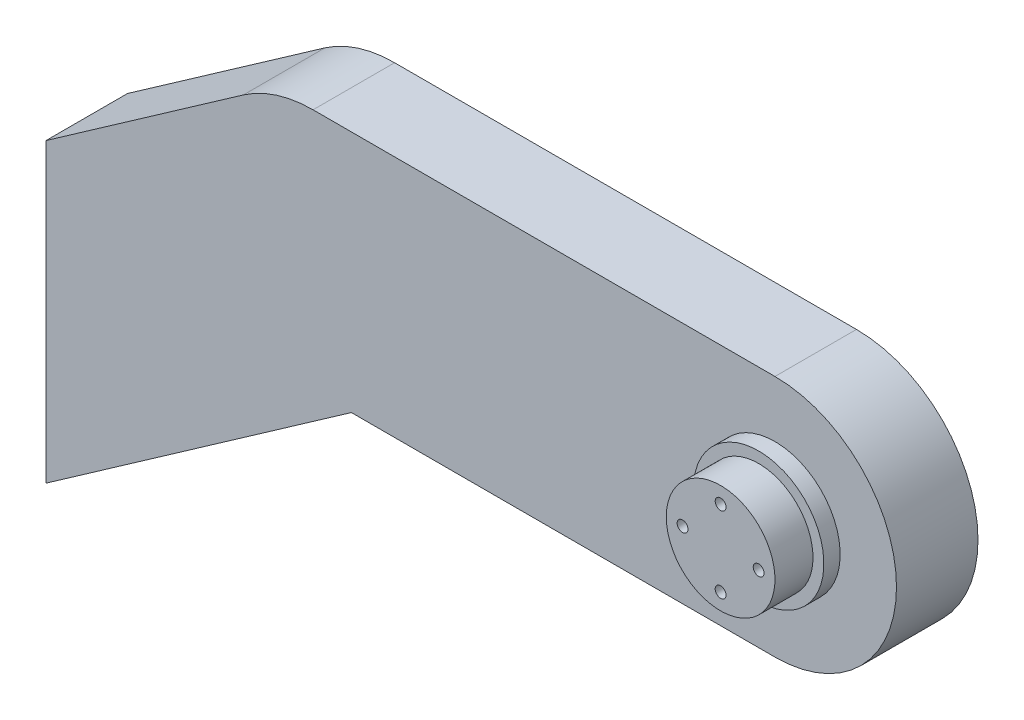
ISO-10303-21;
HEADER;
FILE_DESCRIPTION(('STEP AP214'),'2;1');
FILE_NAME('part.step','',(''),(''),'','','');
FILE_SCHEMA(('AUTOMOTIVE_DESIGN { 1 0 10303 214 1 1 1 1 }'));
ENDSEC;
DATA;
#1=APPLICATION_CONTEXT('core data for automotive mechanical design processes');
#2=APPLICATION_PROTOCOL_DEFINITION('international standard','automotive_design',2000,#1);
#3=PRODUCT_CONTEXT('',#1,'mechanical');
#4=PRODUCT('Part','Part','',(#3));
#5=PRODUCT_RELATED_PRODUCT_CATEGORY('part','',(#4));
#6=PRODUCT_DEFINITION_FORMATION('','',#4);
#7=PRODUCT_DEFINITION_CONTEXT('part definition',#1,'design');
#8=PRODUCT_DEFINITION('design','',#6,#7);
#9=PRODUCT_DEFINITION_SHAPE('','',#8);
#10=(LENGTH_UNIT() NAMED_UNIT(*) SI_UNIT(.MILLI.,.METRE.));
#11=(NAMED_UNIT(*) PLANE_ANGLE_UNIT() SI_UNIT($,.RADIAN.));
#12=(NAMED_UNIT(*) SI_UNIT($,.STERADIAN.) SOLID_ANGLE_UNIT());
#13=UNCERTAINTY_MEASURE_WITH_UNIT(LENGTH_MEASURE(1.E-05),#10,'distance_accuracy_value','');
#14=(GEOMETRIC_REPRESENTATION_CONTEXT(3) GLOBAL_UNCERTAINTY_ASSIGNED_CONTEXT((#13)) GLOBAL_UNIT_ASSIGNED_CONTEXT((#10,
#11,#12)) REPRESENTATION_CONTEXT('',''));
#15=CARTESIAN_POINT('',(0.,0.,0.));
#16=DIRECTION('',(0.,0.,1.));
#17=DIRECTION('',(1.,0.,0.));
#18=AXIS2_PLACEMENT_3D('',#15,#16,#17);
#19=CARTESIAN_POINT('',(153.21162338788,22.365,25.));
#20=DIRECTION('',(0.,0.,-1.));
#21=DIRECTION('',(-1.,0.,0.));
#22=AXIS2_PLACEMENT_3D('',#19,#20,#21);
#23=CYLINDRICAL_SURFACE('',#22,10.);
#24=CARTESIAN_POINT('',(153.21162338788,22.365,25.));
#25=DIRECTION('',(0.,0.,-1.));
#26=DIRECTION('',(-1.,0.,0.));
#27=AXIS2_PLACEMENT_3D('',#24,#25,#26);
#28=CIRCLE('',#27,10.);
#29=CARTESIAN_POINT('',(143.21162338788,22.365,25.));
#30=VERTEX_POINT('',#29);
#31=EDGE_CURVE('E144',#30,#30,#28,.T.);
#32=ORIENTED_EDGE('',*,*,#31,.T.);
#33=EDGE_LOOP('',(#32));
#34=FACE_BOUND('',#33,.T.);
#35=CARTESIAN_POINT('',(153.21162338788,22.365,18.));
#36=DIRECTION('',(0.,0.,-1.));
#37=DIRECTION('',(-1.,0.,0.));
#38=AXIS2_PLACEMENT_3D('',#35,#36,#37);
#39=CIRCLE('',#38,10.);
#40=CARTESIAN_POINT('',(143.21162338788,22.365,18.));
#41=VERTEX_POINT('',#40);
#42=EDGE_CURVE('E195',#41,#41,#39,.T.);
#43=ORIENTED_EDGE('',*,*,#42,.F.);
#44=EDGE_LOOP('',(#43));
#45=FACE_BOUND('',#44,.T.);
#46=ADVANCED_FACE('F50',(#34,#45),#23,.T.);
#47=CARTESIAN_POINT('',(153.21162338788,22.365,25.));
#48=DIRECTION('',(0.,0.,-1.));
#49=DIRECTION('',(-1.,0.,0.));
#50=AXIS2_PLACEMENT_3D('',#47,#48,#49);
#51=PLANE('',#50);
#52=CARTESIAN_POINT('',(153.21162338788,29.365,25.));
#53=DIRECTION('',(0.,0.,1.));
#54=DIRECTION('',(1.,0.,0.));
#55=AXIS2_PLACEMENT_3D('',#52,#53,#54);
#56=CIRCLE('',#55,0.999999999999998);
#57=CARTESIAN_POINT('',(154.21162338788,29.365,25.));
#58=VERTEX_POINT('',#57);
#59=EDGE_CURVE('E151',#58,#58,#56,.T.);
#60=ORIENTED_EDGE('',*,*,#59,.F.);
#61=EDGE_LOOP('',(#60));
#62=FACE_BOUND('',#61,.T.);
#63=CARTESIAN_POINT('',(146.21162338788,22.3649999999999,25.));
#64=DIRECTION('',(0.,0.,1.));
#65=DIRECTION('',(1.,0.,0.));
#66=AXIS2_PLACEMENT_3D('',#63,#64,#65);
#67=CIRCLE('',#66,0.99999999999999);
#68=CARTESIAN_POINT('',(147.21162338788,22.3649999999999,25.));
#69=VERTEX_POINT('',#68);
#70=EDGE_CURVE('E158',#69,#69,#67,.T.);
#71=ORIENTED_EDGE('',*,*,#70,.F.);
#72=EDGE_LOOP('',(#71));
#73=FACE_BOUND('',#72,.T.);
#74=CARTESIAN_POINT('',(153.21162338788,15.365,25.));
#75=DIRECTION('',(0.,0.,1.));
#76=DIRECTION('',(1.,0.,0.));
#77=AXIS2_PLACEMENT_3D('',#74,#75,#76);
#78=CIRCLE('',#77,0.999999999999996);
#79=CARTESIAN_POINT('',(154.21162338788,15.365,25.));
#80=VERTEX_POINT('',#79);
#81=EDGE_CURVE('E154',#80,#80,#78,.T.);
#82=ORIENTED_EDGE('',*,*,#81,.F.);
#83=EDGE_LOOP('',(#82));
#84=FACE_BOUND('',#83,.T.);
#85=CARTESIAN_POINT('',(160.21162338788,22.3650000000002,25.));
#86=DIRECTION('',(0.,0.,1.));
#87=DIRECTION('',(1.,0.,0.));
#88=AXIS2_PLACEMENT_3D('',#85,#86,#87);
#89=CIRCLE('',#88,0.999999999999998);
#90=CARTESIAN_POINT('',(161.21162338788,22.3650000000002,25.));
#91=VERTEX_POINT('',#90);
#92=EDGE_CURVE('E153',#91,#91,#89,.T.);
#93=ORIENTED_EDGE('',*,*,#92,.F.);
#94=EDGE_LOOP('',(#93));
#95=FACE_BOUND('',#94,.T.);
#96=ORIENTED_EDGE('',*,*,#31,.F.);
#97=EDGE_LOOP('',(#96));
#98=FACE_BOUND('',#97,.T.);
#99=ADVANCED_FACE('F204',(#62,#73,#84,#95,#98),#51,.F.);
#100=CARTESIAN_POINT('',(160.21162338788,22.3650000000002,20.));
#101=DIRECTION('',(0.,0.,1.));
#102=DIRECTION('',(1.,0.,0.));
#103=AXIS2_PLACEMENT_3D('',#100,#101,#102);
#104=CYLINDRICAL_SURFACE('',#103,0.999999999999998);
#105=CARTESIAN_POINT('',(160.21162338788,22.3650000000002,20.));
#106=DIRECTION('',(0.,0.,1.));
#107=DIRECTION('',(1.,0.,0.));
#108=AXIS2_PLACEMENT_3D('',#105,#106,#107);
#109=CIRCLE('',#108,0.999999999999998);
#110=CARTESIAN_POINT('',(161.21162338788,22.3650000000002,20.));
#111=VERTEX_POINT('',#110);
#112=EDGE_CURVE('E149',#111,#111,#109,.T.);
#113=ORIENTED_EDGE('',*,*,#112,.F.);
#114=EDGE_LOOP('',(#113));
#115=FACE_BOUND('',#114,.T.);
#116=ORIENTED_EDGE('',*,*,#92,.T.);
#117=EDGE_LOOP('',(#116));
#118=FACE_BOUND('',#117,.T.);
#119=ADVANCED_FACE('F214',(#115,#118),#104,.F.);
#120=CARTESIAN_POINT('',(160.21162338788,22.3650000000002,20.));
#121=DIRECTION('',(0.,0.,1.));
#122=DIRECTION('',(1.,0.,0.));
#123=AXIS2_PLACEMENT_3D('',#120,#121,#122);
#124=PLANE('',#123);
#125=ORIENTED_EDGE('',*,*,#112,.T.);
#126=EDGE_LOOP('',(#125));
#127=FACE_BOUND('',#126,.T.);
#128=ADVANCED_FACE('F258',(#127),#124,.T.);
#129=CARTESIAN_POINT('',(153.21162338788,15.365,20.));
#130=DIRECTION('',(0.,0.,1.));
#131=DIRECTION('',(1.,0.,0.));
#132=AXIS2_PLACEMENT_3D('',#129,#130,#131);
#133=CYLINDRICAL_SURFACE('',#132,0.999999999999996);
#134=CARTESIAN_POINT('',(153.21162338788,15.365,20.));
#135=DIRECTION('',(0.,0.,1.));
#136=DIRECTION('',(1.,0.,0.));
#137=AXIS2_PLACEMENT_3D('',#134,#135,#136);
#138=CIRCLE('',#137,0.999999999999996);
#139=CARTESIAN_POINT('',(154.21162338788,15.365,20.));
#140=VERTEX_POINT('',#139);
#141=EDGE_CURVE('E161',#140,#140,#138,.T.);
#142=ORIENTED_EDGE('',*,*,#141,.F.);
#143=EDGE_LOOP('',(#142));
#144=FACE_BOUND('',#143,.T.);
#145=ORIENTED_EDGE('',*,*,#81,.T.);
#146=EDGE_LOOP('',(#145));
#147=FACE_BOUND('',#146,.T.);
#148=ADVANCED_FACE('F253',(#144,#147),#133,.F.);
#149=CARTESIAN_POINT('',(153.21162338788,15.365,20.));
#150=DIRECTION('',(0.,0.,1.));
#151=DIRECTION('',(1.,0.,0.));
#152=AXIS2_PLACEMENT_3D('',#149,#150,#151);
#153=PLANE('',#152);
#154=ORIENTED_EDGE('',*,*,#141,.T.);
#155=EDGE_LOOP('',(#154));
#156=FACE_BOUND('',#155,.T.);
#157=ADVANCED_FACE('F259',(#156),#153,.T.);
#158=CARTESIAN_POINT('',(146.21162338788,22.3649999999999,20.));
#159=DIRECTION('',(0.,0.,1.));
#160=DIRECTION('',(1.,0.,0.));
#161=AXIS2_PLACEMENT_3D('',#158,#159,#160);
#162=CYLINDRICAL_SURFACE('',#161,0.99999999999999);
#163=CARTESIAN_POINT('',(146.21162338788,22.3649999999999,20.));
#164=DIRECTION('',(0.,0.,1.));
#165=DIRECTION('',(1.,0.,0.));
#166=AXIS2_PLACEMENT_3D('',#163,#164,#165);
#167=CIRCLE('',#166,0.99999999999999);
#168=CARTESIAN_POINT('',(147.21162338788,22.3649999999999,20.));
#169=VERTEX_POINT('',#168);
#170=EDGE_CURVE('E156',#169,#169,#167,.T.);
#171=ORIENTED_EDGE('',*,*,#170,.F.);
#172=EDGE_LOOP('',(#171));
#173=FACE_BOUND('',#172,.T.);
#174=ORIENTED_EDGE('',*,*,#70,.T.);
#175=EDGE_LOOP('',(#174));
#176=FACE_BOUND('',#175,.T.);
#177=ADVANCED_FACE('F262',(#173,#176),#162,.F.);
#178=CARTESIAN_POINT('',(146.21162338788,22.3649999999999,20.));
#179=DIRECTION('',(0.,0.,1.));
#180=DIRECTION('',(1.,0.,0.));
#181=AXIS2_PLACEMENT_3D('',#178,#179,#180);
#182=PLANE('',#181);
#183=ORIENTED_EDGE('',*,*,#170,.T.);
#184=EDGE_LOOP('',(#183));
#185=FACE_BOUND('',#184,.T.);
#186=ADVANCED_FACE('F254',(#185),#182,.T.);
#187=CARTESIAN_POINT('',(153.21162338788,29.365,20.));
#188=DIRECTION('',(0.,0.,1.));
#189=DIRECTION('',(1.,0.,0.));
#190=AXIS2_PLACEMENT_3D('',#187,#188,#189);
#191=CYLINDRICAL_SURFACE('',#190,0.999999999999998);
#192=CARTESIAN_POINT('',(153.21162338788,29.365,20.));
#193=DIRECTION('',(0.,0.,1.));
#194=DIRECTION('',(1.,0.,0.));
#195=AXIS2_PLACEMENT_3D('',#192,#193,#194);
#196=CIRCLE('',#195,0.999999999999998);
#197=CARTESIAN_POINT('',(154.21162338788,29.365,20.));
#198=VERTEX_POINT('',#197);
#199=EDGE_CURVE('E147',#198,#198,#196,.T.);
#200=ORIENTED_EDGE('',*,*,#199,.F.);
#201=EDGE_LOOP('',(#200));
#202=FACE_BOUND('',#201,.T.);
#203=ORIENTED_EDGE('',*,*,#59,.T.);
#204=EDGE_LOOP('',(#203));
#205=FACE_BOUND('',#204,.T.);
#206=ADVANCED_FACE('F248',(#202,#205),#191,.F.);
#207=CARTESIAN_POINT('',(153.21162338788,29.365,20.));
#208=DIRECTION('',(0.,0.,1.));
#209=DIRECTION('',(1.,0.,0.));
#210=AXIS2_PLACEMENT_3D('',#207,#208,#209);
#211=PLANE('',#210);
#212=ORIENTED_EDGE('',*,*,#199,.T.);
#213=EDGE_LOOP('',(#212));
#214=FACE_BOUND('',#213,.T.);
#215=ADVANCED_FACE('F244',(#214),#211,.T.);
#216=CARTESIAN_POINT('',(153.21162338788,22.365,18.));
#217=DIRECTION('',(0.,0.,-1.));
#218=DIRECTION('',(-1.,0.,0.));
#219=AXIS2_PLACEMENT_3D('',#216,#217,#218);
#220=CYLINDRICAL_SURFACE('',#219,12.);
#221=CARTESIAN_POINT('',(153.21162338788,22.365,18.));
#222=DIRECTION('',(0.,0.,-1.));
#223=DIRECTION('',(-1.,0.,0.));
#224=AXIS2_PLACEMENT_3D('',#221,#222,#223);
#225=CIRCLE('',#224,12.);
#226=CARTESIAN_POINT('',(141.21162338788,22.365,18.));
#227=VERTEX_POINT('',#226);
#228=EDGE_CURVE('E128',#227,#227,#225,.T.);
#229=ORIENTED_EDGE('',*,*,#228,.T.);
#230=EDGE_LOOP('',(#229));
#231=FACE_BOUND('',#230,.T.);
#232=CARTESIAN_POINT('',(153.21162338788,22.365,15.));
#233=DIRECTION('',(0.,0.,-1.));
#234=DIRECTION('',(-1.,0.,0.));
#235=AXIS2_PLACEMENT_3D('',#232,#233,#234);
#236=CIRCLE('',#235,12.);
#237=CARTESIAN_POINT('',(141.21162338788,22.365,15.));
#238=VERTEX_POINT('',#237);
#239=EDGE_CURVE('E192',#238,#238,#236,.T.);
#240=ORIENTED_EDGE('',*,*,#239,.F.);
#241=EDGE_LOOP('',(#240));
#242=FACE_BOUND('',#241,.T.);
#243=ADVANCED_FACE('F247',(#231,#242),#220,.T.);
#244=CARTESIAN_POINT('',(153.21162338788,22.365,18.));
#245=DIRECTION('',(0.,0.,-1.));
#246=DIRECTION('',(-1.,0.,0.));
#247=AXIS2_PLACEMENT_3D('',#244,#245,#246);
#248=PLANE('',#247);
#249=ORIENTED_EDGE('',*,*,#42,.T.);
#250=EDGE_LOOP('',(#249));
#251=FACE_BOUND('',#250,.T.);
#252=ORIENTED_EDGE('',*,*,#228,.F.);
#253=EDGE_LOOP('',(#252));
#254=FACE_BOUND('',#253,.T.);
#255=ADVANCED_FACE('F201',(#251,#254),#248,.F.);
#256=CARTESIAN_POINT('',(0.,0.,0.));
#257=DIRECTION('',(0.,0.,-1.));
#258=DIRECTION('',(-1.,0.,0.));
#259=AXIS2_PLACEMENT_3D('',#256,#257,#258);
#260=PLANE('',#259);
#261=DIRECTION('',(0.,-1.,0.));
#262=VECTOR('',#261,1.);
#263=CARTESIAN_POINT('',(19.0625007305404,0.,0.));
#264=LINE('',#263,#262);
#265=CARTESIAN_POINT('',(19.0625007305404,15.2530374965872,0.));
#266=VERTEX_POINT('',#265);
#267=CARTESIAN_POINT('',(19.0625007305404,-39.3522098587128,0.));
#268=VERTEX_POINT('',#267);
#269=EDGE_CURVE('E181',#266,#268,#264,.T.);
#270=ORIENTED_EDGE('',*,*,#269,.F.);
#271=DIRECTION('',(-0.819152044288991,-0.573576436351047,0.));
#272=VECTOR('',#271,1.);
#273=CARTESIAN_POINT('',(55.3835863888887,40.6853354705233,0.));
#274=LINE('',#273,#272);
#275=CARTESIAN_POINT('',(55.3835863888887,40.6853354705233,0.));
#276=VERTEX_POINT('',#275);
#277=EDGE_CURVE('E125',#276,#266,#274,.T.);
#278=ORIENTED_EDGE('',*,*,#277,.F.);
#279=CARTESIAN_POINT('',(68.2116233878799,22.365,0.));
#280=DIRECTION('',(0.,0.,1.));
#281=DIRECTION('',(-1.,0.,0.));
#282=AXIS2_PLACEMENT_3D('',#279,#280,#281);
#283=CIRCLE('',#282,22.365);
#284=CARTESIAN_POINT('',(68.2116233878799,44.73,0.));
#285=VERTEX_POINT('',#284);
#286=EDGE_CURVE('E112',#285,#276,#283,.T.);
#287=ORIENTED_EDGE('',*,*,#286,.F.);
#288=DIRECTION('',(-1.,0.,0.));
#289=VECTOR('',#288,1.);
#290=CARTESIAN_POINT('',(0.,44.73,0.));
#291=LINE('',#290,#289);
#292=CARTESIAN_POINT('',(153.21162338788,44.73,0.));
#293=VERTEX_POINT('',#292);
#294=EDGE_CURVE('E51',#293,#285,#291,.T.);
#295=ORIENTED_EDGE('',*,*,#294,.F.);
#296=CARTESIAN_POINT('',(153.21162338788,22.365,0.));
#297=DIRECTION('',(0.,0.,-1.));
#298=DIRECTION('',(-1.,0.,0.));
#299=AXIS2_PLACEMENT_3D('',#296,#297,#298);
#300=CIRCLE('',#299,22.365);
#301=CARTESIAN_POINT('',(153.21162338788,0.,0.));
#302=VERTEX_POINT('',#301);
#303=EDGE_CURVE('E145',#302,#293,#300,.F.);
#304=ORIENTED_EDGE('',*,*,#303,.F.);
#305=DIRECTION('',(1.,0.,0.));
#306=VECTOR('',#305,1.);
#307=CARTESIAN_POINT('',(0.,0.,0.));
#308=LINE('',#307,#306);
#309=CARTESIAN_POINT('',(75.2632808011584,0.,0.));
#310=VERTEX_POINT('',#309);
#311=EDGE_CURVE('E71',#310,#302,#308,.T.);
#312=ORIENTED_EDGE('',*,*,#311,.F.);
#313=DIRECTION('',(-0.819152044288991,-0.573576436351047,0.));
#314=VECTOR('',#313,1.);
#315=CARTESIAN_POINT('',(24.7608613571932,-35.3621747924932,0.));
#316=LINE('',#315,#314);
#317=EDGE_CURVE('E178',#310,#268,#316,.T.);
#318=ORIENTED_EDGE('',*,*,#317,.T.);
#319=EDGE_LOOP('',(#270,#278,#287,#295,#304,#312,#318));
#320=FACE_BOUND('',#319,.T.);
#321=ADVANCED_FACE('F126',(#320),#260,.T.);
#322=CARTESIAN_POINT('',(68.2116233878799,22.365,96.5695927733488));
#323=DIRECTION('',(0.,0.,-1.));
#324=DIRECTION('',(-1.,0.,0.));
#325=AXIS2_PLACEMENT_3D('',#322,#323,#324);
#326=CYLINDRICAL_SURFACE('',#325,22.365);
#327=CARTESIAN_POINT('',(68.2116233878799,22.365,15.));
#328=DIRECTION('',(0.,0.,-1.));
#329=DIRECTION('',(-1.,0.,0.));
#330=AXIS2_PLACEMENT_3D('',#327,#328,#329);
#331=CIRCLE('',#330,22.365);
#332=CARTESIAN_POINT('',(55.3835863888887,40.6853354705233,15.));
#333=VERTEX_POINT('',#332);
#334=CARTESIAN_POINT('',(68.2116233878799,44.73,15.));
#335=VERTEX_POINT('',#334);
#336=EDGE_CURVE('E120',#333,#335,#331,.T.);
#337=ORIENTED_EDGE('',*,*,#336,.T.);
#338=DIRECTION('',(0.,0.,-1.));
#339=VECTOR('',#338,1.);
#340=CARTESIAN_POINT('',(68.2116233878799,44.73,96.5695927733488));
#341=LINE('',#340,#339);
#342=EDGE_CURVE('E109',#335,#285,#341,.T.);
#343=ORIENTED_EDGE('',*,*,#342,.T.);
#344=ORIENTED_EDGE('',*,*,#286,.T.);
#345=DIRECTION('',(0.,0.,-1.));
#346=VECTOR('',#345,1.);
#347=CARTESIAN_POINT('',(55.3835863888887,40.6853354705233,96.5695927733488));
#348=LINE('',#347,#346);
#349=EDGE_CURVE('E122',#333,#276,#348,.T.);
#350=ORIENTED_EDGE('',*,*,#349,.F.);
#351=EDGE_LOOP('',(#337,#343,#344,#350));
#352=FACE_BOUND('',#351,.T.);
#353=ADVANCED_FACE('F115',(#352),#326,.T.);
#354=CARTESIAN_POINT('',(0.,44.73,15.));
#355=DIRECTION('',(0.,-1.,0.));
#356=DIRECTION('',(0.,0.,-1.));
#357=AXIS2_PLACEMENT_3D('',#354,#355,#356);
#358=PLANE('',#357);
#359=ORIENTED_EDGE('',*,*,#294,.T.);
#360=ORIENTED_EDGE('',*,*,#342,.F.);
#361=DIRECTION('',(-1.,0.,0.));
#362=VECTOR('',#361,1.);
#363=CARTESIAN_POINT('',(0.,44.73,15.));
#364=LINE('',#363,#362);
#365=CARTESIAN_POINT('',(153.21162338788,44.73,15.));
#366=VERTEX_POINT('',#365);
#367=EDGE_CURVE('E11',#366,#335,#364,.T.);
#368=ORIENTED_EDGE('',*,*,#367,.F.);
#369=DIRECTION('',(0.,0.,1.));
#370=VECTOR('',#369,1.);
#371=CARTESIAN_POINT('',(153.21162338788,44.73,-0.000999999999999265));
#372=LINE('',#371,#370);
#373=EDGE_CURVE('E132',#293,#366,#372,.T.);
#374=ORIENTED_EDGE('',*,*,#373,.F.);
#375=EDGE_LOOP('',(#359,#360,#368,#374));
#376=FACE_BOUND('',#375,.T.);
#377=ADVANCED_FACE('F134',(#376),#358,.F.);
#378=CARTESIAN_POINT('',(153.21162338788,22.365,-0.000999999999999265));
#379=DIRECTION('',(0.,0.,1.));
#380=DIRECTION('',(1.,0.,0.));
#381=AXIS2_PLACEMENT_3D('',#378,#379,#380);
#382=CYLINDRICAL_SURFACE('',#381,22.365);
#383=ORIENTED_EDGE('',*,*,#303,.T.);
#384=ORIENTED_EDGE('',*,*,#373,.T.);
#385=CARTESIAN_POINT('',(153.21162338788,22.365,15.));
#386=DIRECTION('',(0.,0.,1.));
#387=DIRECTION('',(1.,0.,0.));
#388=AXIS2_PLACEMENT_3D('',#385,#386,#387);
#389=CIRCLE('',#388,22.365);
#390=CARTESIAN_POINT('',(153.21162338788,0.,15.));
#391=VERTEX_POINT('',#390);
#392=EDGE_CURVE('E137',#391,#366,#389,.T.);
#393=ORIENTED_EDGE('',*,*,#392,.F.);
#394=DIRECTION('',(0.,0.,1.));
#395=VECTOR('',#394,1.);
#396=CARTESIAN_POINT('',(153.21162338788,0.,-0.000999999999999265));
#397=LINE('',#396,#395);
#398=EDGE_CURVE('E131',#302,#391,#397,.T.);
#399=ORIENTED_EDGE('',*,*,#398,.F.);
#400=EDGE_LOOP('',(#383,#384,#393,#399));
#401=FACE_BOUND('',#400,.T.);
#402=ADVANCED_FACE('F217',(#401),#382,.T.);
#403=CARTESIAN_POINT('',(0.,0.,15.));
#404=DIRECTION('',(0.,1.,0.));
#405=DIRECTION('',(0.,0.,1.));
#406=AXIS2_PLACEMENT_3D('',#403,#404,#405);
#407=PLANE('',#406);
#408=DIRECTION('',(1.,0.,0.));
#409=VECTOR('',#408,1.);
#410=CARTESIAN_POINT('',(0.,0.,15.));
#411=LINE('',#410,#409);
#412=CARTESIAN_POINT('',(75.2632808011584,0.,15.));
#413=VERTEX_POINT('',#412);
#414=EDGE_CURVE('E57',#413,#391,#411,.T.);
#415=ORIENTED_EDGE('',*,*,#414,.F.);
#416=DIRECTION('',(0.,0.,-1.));
#417=VECTOR('',#416,1.);
#418=CARTESIAN_POINT('',(75.2632808011584,0.,192.669605183108));
#419=LINE('',#418,#417);
#420=EDGE_CURVE('E63',#413,#310,#419,.T.);
#421=ORIENTED_EDGE('',*,*,#420,.T.);
#422=ORIENTED_EDGE('',*,*,#311,.T.);
#423=ORIENTED_EDGE('',*,*,#398,.T.);
#424=EDGE_LOOP('',(#415,#421,#422,#423));
#425=FACE_BOUND('',#424,.T.);
#426=ADVANCED_FACE('F47',(#425),#407,.F.);
#427=CARTESIAN_POINT('',(24.7608613571932,-35.3621747924932,192.669605183108));
#428=DIRECTION('',(0.573576436351047,-0.819152044288991,0.));
#429=DIRECTION('',(0.819152044288991,0.573576436351047,0.));
#430=AXIS2_PLACEMENT_3D('',#427,#428,#429);
#431=PLANE('',#430);
#432=DIRECTION('',(0.819152044288991,0.573576436351047,0.));
#433=VECTOR('',#432,1.);
#434=CARTESIAN_POINT('',(24.7608613571932,-35.3621747924932,15.));
#435=LINE('',#434,#433);
#436=CARTESIAN_POINT('',(19.0625007305404,-39.3522098587128,15.));
#437=VERTEX_POINT('',#436);
#438=EDGE_CURVE('E159',#437,#413,#435,.T.);
#439=ORIENTED_EDGE('',*,*,#438,.F.);
#440=DIRECTION('',(0.,0.,-1.));
#441=VECTOR('',#440,1.);
#442=CARTESIAN_POINT('',(19.0625007305404,-39.3522098587128,192.669605183108));
#443=LINE('',#442,#441);
#444=EDGE_CURVE('E172',#437,#268,#443,.T.);
#445=ORIENTED_EDGE('',*,*,#444,.T.);
#446=ORIENTED_EDGE('',*,*,#317,.F.);
#447=ORIENTED_EDGE('',*,*,#420,.F.);
#448=EDGE_LOOP('',(#439,#445,#446,#447));
#449=FACE_BOUND('',#448,.T.);
#450=ADVANCED_FACE('F237',(#449),#431,.T.);
#451=CARTESIAN_POINT('',(19.0625007305404,0.,192.669605183108));
#452=DIRECTION('',(1.,0.,0.));
#453=DIRECTION('',(0.,0.,-1.));
#454=AXIS2_PLACEMENT_3D('',#451,#452,#453);
#455=PLANE('',#454);
#456=DIRECTION('',(0.,1.,0.));
#457=VECTOR('',#456,1.);
#458=CARTESIAN_POINT('',(19.0625007305404,0.,15.));
#459=LINE('',#458,#457);
#460=CARTESIAN_POINT('',(19.0625007305404,15.2530374965872,15.));
#461=VERTEX_POINT('',#460);
#462=EDGE_CURVE('E173',#437,#461,#459,.T.);
#463=ORIENTED_EDGE('',*,*,#462,.T.);
#464=DIRECTION('',(0.,0.,-1.));
#465=VECTOR('',#464,1.);
#466=CARTESIAN_POINT('',(19.0625007305404,15.2530374965872,96.5695927733488));
#467=LINE('',#466,#465);
#468=EDGE_CURVE('E187',#461,#266,#467,.T.);
#469=ORIENTED_EDGE('',*,*,#468,.T.);
#470=ORIENTED_EDGE('',*,*,#269,.T.);
#471=ORIENTED_EDGE('',*,*,#444,.F.);
#472=EDGE_LOOP('',(#463,#469,#470,#471));
#473=FACE_BOUND('',#472,.T.);
#474=ADVANCED_FACE('F241',(#473),#455,.F.);
#475=CARTESIAN_POINT('',(55.3835863888887,40.6853354705233,96.5695927733488));
#476=DIRECTION('',(0.573576436351047,-0.819152044288991,0.));
#477=DIRECTION('',(0.819152044288991,0.573576436351047,0.));
#478=AXIS2_PLACEMENT_3D('',#475,#476,#477);
#479=PLANE('',#478);
#480=DIRECTION('',(0.819152044288991,0.573576436351047,0.));
#481=VECTOR('',#480,1.);
#482=CARTESIAN_POINT('',(55.3835863888887,40.6853354705233,15.));
#483=LINE('',#482,#481);
#484=EDGE_CURVE('E182',#461,#333,#483,.T.);
#485=ORIENTED_EDGE('',*,*,#484,.T.);
#486=ORIENTED_EDGE('',*,*,#349,.T.);
#487=ORIENTED_EDGE('',*,*,#277,.T.);
#488=ORIENTED_EDGE('',*,*,#468,.F.);
#489=EDGE_LOOP('',(#485,#486,#487,#488));
#490=FACE_BOUND('',#489,.T.);
#491=ADVANCED_FACE('F224',(#490),#479,.F.);
#492=CARTESIAN_POINT('',(0.,0.,15.));
#493=DIRECTION('',(0.,0.,-1.));
#494=DIRECTION('',(-1.,0.,0.));
#495=AXIS2_PLACEMENT_3D('',#492,#493,#494);
#496=PLANE('',#495);
#497=ORIENTED_EDGE('',*,*,#239,.T.);
#498=EDGE_LOOP('',(#497));
#499=FACE_BOUND('',#498,.T.);
#500=ORIENTED_EDGE('',*,*,#484,.F.);
#501=ORIENTED_EDGE('',*,*,#462,.F.);
#502=ORIENTED_EDGE('',*,*,#438,.T.);
#503=ORIENTED_EDGE('',*,*,#414,.T.);
#504=ORIENTED_EDGE('',*,*,#392,.T.);
#505=ORIENTED_EDGE('',*,*,#367,.T.);
#506=ORIENTED_EDGE('',*,*,#336,.F.);
#507=EDGE_LOOP('',(#500,#501,#502,#503,#504,#505,#506));
#508=FACE_BOUND('',#507,.T.);
#509=ADVANCED_FACE('F225',(#499,#508),#496,.F.);
#510=CLOSED_SHELL('',(#46,#99,#119,#128,#148,#157,#177,#186,#206,#215,#243,#255,#321,#353,#377,
#402,#426,#450,#474,#491,#509));
#511=MANIFOLD_SOLID_BREP('B2',#510);
#512=ADVANCED_BREP_SHAPE_REPRESENTATION('',(#18,#511),#14);
#513=SHAPE_DEFINITION_REPRESENTATION(#9,#512);
ENDSEC;
END-ISO-10303-21;
